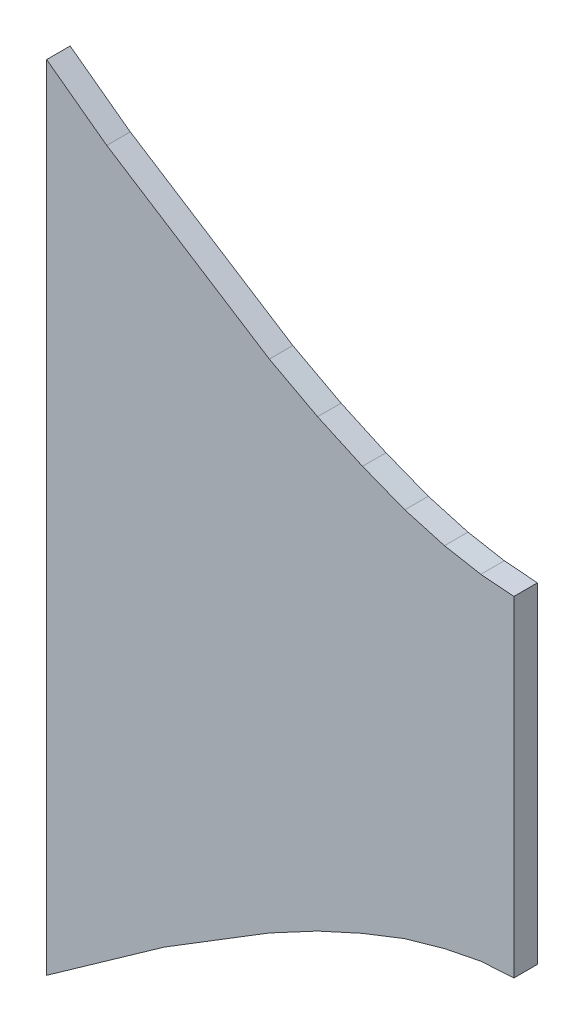
ISO-10303-21;
HEADER;
FILE_DESCRIPTION(('STEP AP214'),'2;1');
FILE_NAME('part.step','',(''),(''),'','','');
FILE_SCHEMA(('AUTOMOTIVE_DESIGN { 1 0 10303 214 1 1 1 1 }'));
ENDSEC;
DATA;
#1=APPLICATION_CONTEXT('core data for automotive mechanical design processes');
#2=APPLICATION_PROTOCOL_DEFINITION('international standard','automotive_design',2000,#1);
#3=PRODUCT_CONTEXT('',#1,'mechanical');
#4=PRODUCT('Part','Part','',(#3));
#5=PRODUCT_RELATED_PRODUCT_CATEGORY('part','',(#4));
#6=PRODUCT_DEFINITION_FORMATION('','',#4);
#7=PRODUCT_DEFINITION_CONTEXT('part definition',#1,'design');
#8=PRODUCT_DEFINITION('design','',#6,#7);
#9=PRODUCT_DEFINITION_SHAPE('','',#8);
#10=(LENGTH_UNIT() NAMED_UNIT(*) SI_UNIT(.MILLI.,.METRE.));
#11=(NAMED_UNIT(*) PLANE_ANGLE_UNIT() SI_UNIT($,.RADIAN.));
#12=(NAMED_UNIT(*) SI_UNIT($,.STERADIAN.) SOLID_ANGLE_UNIT());
#13=UNCERTAINTY_MEASURE_WITH_UNIT(LENGTH_MEASURE(1.E-05),#10,'distance_accuracy_value','');
#14=(GEOMETRIC_REPRESENTATION_CONTEXT(3) GLOBAL_UNCERTAINTY_ASSIGNED_CONTEXT((#13)) GLOBAL_UNIT_ASSIGNED_CONTEXT((#10,
#11,#12)) REPRESENTATION_CONTEXT('',''));
#15=CARTESIAN_POINT('',(0.,0.,0.));
#16=DIRECTION('',(0.,0.,1.));
#17=DIRECTION('',(1.,0.,0.));
#18=AXIS2_PLACEMENT_3D('',#15,#16,#17);
#19=CARTESIAN_POINT('',(51.8079986572266,109.157997131348,0.));
#20=DIRECTION('',(-1.,0.,0.));
#21=DIRECTION('',(0.,1.,0.));
#22=AXIS2_PLACEMENT_3D('',#19,#20,#21);
#23=PLANE('',#22);
#24=DIRECTION('',(0.,1.,0.));
#25=VECTOR('',#24,1.);
#26=CARTESIAN_POINT('',(51.8079986572266,109.157997131348,0.03556));
#27=LINE('',#26,#25);
#28=CARTESIAN_POINT('',(51.8079986572266,109.157997131348,0.03556));
#29=VERTEX_POINT('',#28);
#30=CARTESIAN_POINT('',(51.8079986572266,109.657997131348,0.03556));
#31=VERTEX_POINT('',#30);
#32=EDGE_CURVE('E11',#29,#31,#27,.T.);
#33=ORIENTED_EDGE('',*,*,#32,.F.);
#34=DIRECTION('',(0.,0.,1.));
#35=VECTOR('',#34,1.);
#36=CARTESIAN_POINT('',(51.8079986572266,109.157997131348,0.));
#37=LINE('',#36,#35);
#38=CARTESIAN_POINT('',(51.8079986572266,109.157997131348,0.));
#39=VERTEX_POINT('',#38);
#40=EDGE_CURVE('E24',#39,#29,#37,.T.);
#41=ORIENTED_EDGE('',*,*,#40,.F.);
#42=DIRECTION('',(0.,1.,0.));
#43=VECTOR('',#42,1.);
#44=CARTESIAN_POINT('',(51.8079986572266,109.157997131348,0.));
#45=LINE('',#44,#43);
#46=CARTESIAN_POINT('',(51.8079986572266,109.657997131348,0.));
#47=VERTEX_POINT('',#46);
#48=EDGE_CURVE('E323',#39,#47,#45,.T.);
#49=ORIENTED_EDGE('',*,*,#48,.T.);
#50=DIRECTION('',(0.,0.,1.));
#51=VECTOR('',#50,1.);
#52=CARTESIAN_POINT('',(51.8079986572266,109.657997131348,0.));
#53=LINE('',#52,#51);
#54=EDGE_CURVE('E37',#47,#31,#53,.T.);
#55=ORIENTED_EDGE('',*,*,#54,.T.);
#56=EDGE_LOOP('',(#33,#41,#49,#55));
#57=FACE_BOUND('',#56,.T.);
#58=ADVANCED_FACE('F17',(#57),#23,.F.);
#59=CARTESIAN_POINT('',(51.757999420166,109.154998779297,0.));
#60=DIRECTION('',(-0.0598604189522905,0.998206757261669,0.));
#61=DIRECTION('',(0.998206757261669,0.0598604189522905,0.));
#62=AXIS2_PLACEMENT_3D('',#59,#60,#61);
#63=PLANE('',#62);
#64=DIRECTION('',(0.998206757261669,0.0598604189522905,0.));
#65=VECTOR('',#64,1.);
#66=CARTESIAN_POINT('',(51.757999420166,109.154998779297,0.03556));
#67=LINE('',#66,#65);
#68=CARTESIAN_POINT('',(51.757999420166,109.154998779297,0.03556));
#69=VERTEX_POINT('',#68);
#70=EDGE_CURVE('E319',#69,#29,#67,.T.);
#71=ORIENTED_EDGE('',*,*,#70,.F.);
#72=DIRECTION('',(0.,0.,1.));
#73=VECTOR('',#72,1.);
#74=CARTESIAN_POINT('',(51.757999420166,109.154998779297,0.));
#75=LINE('',#74,#73);
#76=CARTESIAN_POINT('',(51.757999420166,109.154998779297,0.));
#77=VERTEX_POINT('',#76);
#78=EDGE_CURVE('E317',#77,#69,#75,.T.);
#79=ORIENTED_EDGE('',*,*,#78,.F.);
#80=DIRECTION('',(0.998206757261669,0.0598604189522905,0.));
#81=VECTOR('',#80,1.);
#82=CARTESIAN_POINT('',(51.757999420166,109.154998779297,0.));
#83=LINE('',#82,#81);
#84=EDGE_CURVE('E315',#77,#39,#83,.T.);
#85=ORIENTED_EDGE('',*,*,#84,.T.);
#86=ORIENTED_EDGE('',*,*,#40,.T.);
#87=EDGE_LOOP('',(#71,#79,#85,#86));
#88=FACE_BOUND('',#87,.T.);
#89=ADVANCED_FACE('F326',(#88),#63,.F.);
#90=CARTESIAN_POINT('',(51.7029991149902,109.143997192383,0.));
#91=DIRECTION('',(-0.196142292954482,0.980575443764812,0.));
#92=DIRECTION('',(0.980575443764812,0.196142292954482,0.));
#93=AXIS2_PLACEMENT_3D('',#90,#91,#92);
#94=PLANE('',#93);
#95=DIRECTION('',(0.980575443764812,0.196142292954482,0.));
#96=VECTOR('',#95,1.);
#97=CARTESIAN_POINT('',(51.7029991149902,109.143997192383,0.03556));
#98=LINE('',#97,#96);
#99=CARTESIAN_POINT('',(51.7029991149902,109.143997192383,0.03556));
#100=VERTEX_POINT('',#99);
#101=EDGE_CURVE('E312',#100,#69,#98,.T.);
#102=ORIENTED_EDGE('',*,*,#101,.F.);
#103=DIRECTION('',(0.,0.,1.));
#104=VECTOR('',#103,1.);
#105=CARTESIAN_POINT('',(51.7029991149902,109.143997192383,0.));
#106=LINE('',#105,#104);
#107=CARTESIAN_POINT('',(51.7029991149902,109.143997192383,0.));
#108=VERTEX_POINT('',#107);
#109=EDGE_CURVE('E310',#108,#100,#106,.T.);
#110=ORIENTED_EDGE('',*,*,#109,.F.);
#111=DIRECTION('',(0.980575443764812,0.196142292954482,0.));
#112=VECTOR('',#111,1.);
#113=CARTESIAN_POINT('',(51.7029991149902,109.143997192383,0.));
#114=LINE('',#113,#112);
#115=EDGE_CURVE('E307',#108,#77,#114,.T.);
#116=ORIENTED_EDGE('',*,*,#115,.T.);
#117=ORIENTED_EDGE('',*,*,#78,.T.);
#118=EDGE_LOOP('',(#102,#110,#116,#117));
#119=FACE_BOUND('',#118,.T.);
#120=ADVANCED_FACE('F329',(#119),#94,.F.);
#121=CARTESIAN_POINT('',(51.6430015563965,109.126998901367,0.));
#122=DIRECTION('',(-0.272587471829552,0.962131004698203,0.));
#123=DIRECTION('',(0.962131004698203,0.272587471829552,0.));
#124=AXIS2_PLACEMENT_3D('',#121,#122,#123);
#125=PLANE('',#124);
#126=DIRECTION('',(0.962131004698203,0.272587471829552,0.));
#127=VECTOR('',#126,1.);
#128=CARTESIAN_POINT('',(51.6430015563965,109.126998901367,0.03556));
#129=LINE('',#128,#127);
#130=CARTESIAN_POINT('',(51.6430015563965,109.126998901367,0.03556));
#131=VERTEX_POINT('',#130);
#132=EDGE_CURVE('E304',#131,#100,#129,.T.);
#133=ORIENTED_EDGE('',*,*,#132,.F.);
#134=DIRECTION('',(0.,0.,1.));
#135=VECTOR('',#134,1.);
#136=CARTESIAN_POINT('',(51.6430015563965,109.126998901367,0.));
#137=LINE('',#136,#135);
#138=CARTESIAN_POINT('',(51.6430015563965,109.126998901367,0.));
#139=VERTEX_POINT('',#138);
#140=EDGE_CURVE('E302',#139,#131,#137,.T.);
#141=ORIENTED_EDGE('',*,*,#140,.F.);
#142=DIRECTION('',(0.962131004698203,0.272587471829552,0.));
#143=VECTOR('',#142,1.);
#144=CARTESIAN_POINT('',(51.6430015563965,109.126998901367,0.));
#145=LINE('',#144,#143);
#146=EDGE_CURVE('E299',#139,#108,#145,.T.);
#147=ORIENTED_EDGE('',*,*,#146,.T.);
#148=ORIENTED_EDGE('',*,*,#109,.T.);
#149=EDGE_LOOP('',(#133,#141,#147,#148));
#150=FACE_BOUND('',#149,.T.);
#151=ADVANCED_FACE('F334',(#150),#125,.F.);
#152=CARTESIAN_POINT('',(51.5789985656738,109.101997375488,0.));
#153=DIRECTION('',(-0.363855042774888,0.931455585547311,0.));
#154=DIRECTION('',(0.931455585547311,0.363855042774888,0.));
#155=AXIS2_PLACEMENT_3D('',#152,#153,#154);
#156=PLANE('',#155);
#157=DIRECTION('',(0.931455585547311,0.363855042774888,0.));
#158=VECTOR('',#157,1.);
#159=CARTESIAN_POINT('',(51.5789985656738,109.101997375488,0.03556));
#160=LINE('',#159,#158);
#161=CARTESIAN_POINT('',(51.5789985656738,109.101997375488,0.03556));
#162=VERTEX_POINT('',#161);
#163=EDGE_CURVE('E296',#162,#131,#160,.T.);
#164=ORIENTED_EDGE('',*,*,#163,.F.);
#165=DIRECTION('',(0.,0.,1.));
#166=VECTOR('',#165,1.);
#167=CARTESIAN_POINT('',(51.5789985656738,109.101997375488,0.));
#168=LINE('',#167,#166);
#169=CARTESIAN_POINT('',(51.5789985656738,109.101997375488,0.));
#170=VERTEX_POINT('',#169);
#171=EDGE_CURVE('E294',#170,#162,#168,.T.);
#172=ORIENTED_EDGE('',*,*,#171,.F.);
#173=DIRECTION('',(0.931455585547311,0.363855042774888,0.));
#174=VECTOR('',#173,1.);
#175=CARTESIAN_POINT('',(51.5789985656738,109.101997375488,0.));
#176=LINE('',#175,#174);
#177=EDGE_CURVE('E291',#170,#139,#176,.T.);
#178=ORIENTED_EDGE('',*,*,#177,.T.);
#179=ORIENTED_EDGE('',*,*,#140,.T.);
#180=EDGE_LOOP('',(#164,#172,#178,#179));
#181=FACE_BOUND('',#180,.T.);
#182=ADVANCED_FACE('F337',(#181),#156,.F.);
#183=CARTESIAN_POINT('',(51.5110015869141,109.070999145508,0.));
#184=DIRECTION('',(-0.414806497087757,0.909909649346453,0.));
#185=DIRECTION('',(0.909909649346453,0.414806497087757,0.));
#186=AXIS2_PLACEMENT_3D('',#183,#184,#185);
#187=PLANE('',#186);
#188=DIRECTION('',(0.909909649346453,0.414806497087757,0.));
#189=VECTOR('',#188,1.);
#190=CARTESIAN_POINT('',(51.5110015869141,109.070999145508,0.03556));
#191=LINE('',#190,#189);
#192=CARTESIAN_POINT('',(51.5110015869141,109.070999145508,0.03556));
#193=VERTEX_POINT('',#192);
#194=EDGE_CURVE('E288',#193,#162,#191,.T.);
#195=ORIENTED_EDGE('',*,*,#194,.F.);
#196=DIRECTION('',(0.,0.,1.));
#197=VECTOR('',#196,1.);
#198=CARTESIAN_POINT('',(51.5110015869141,109.070999145508,0.));
#199=LINE('',#198,#197);
#200=CARTESIAN_POINT('',(51.5110015869141,109.070999145508,0.));
#201=VERTEX_POINT('',#200);
#202=EDGE_CURVE('E286',#201,#193,#199,.T.);
#203=ORIENTED_EDGE('',*,*,#202,.F.);
#204=DIRECTION('',(0.909909649346453,0.414806497087757,0.));
#205=VECTOR('',#204,1.);
#206=CARTESIAN_POINT('',(51.5110015869141,109.070999145508,0.));
#207=LINE('',#206,#205);
#208=EDGE_CURVE('E283',#201,#170,#207,.T.);
#209=ORIENTED_EDGE('',*,*,#208,.T.);
#210=ORIENTED_EDGE('',*,*,#171,.T.);
#211=EDGE_LOOP('',(#195,#203,#209,#210));
#212=FACE_BOUND('',#211,.T.);
#213=ADVANCED_FACE('F342',(#212),#187,.F.);
#214=CARTESIAN_POINT('',(51.4379997253418,109.031997680664,0.));
#215=DIRECTION('',(-0.471219653352262,0.882015894581597,0.));
#216=DIRECTION('',(0.882015894581597,0.471219653352262,0.));
#217=AXIS2_PLACEMENT_3D('',#214,#215,#216);
#218=PLANE('',#217);
#219=DIRECTION('',(0.882015894581597,0.471219653352262,0.));
#220=VECTOR('',#219,1.);
#221=CARTESIAN_POINT('',(51.4379997253418,109.031997680664,0.03556));
#222=LINE('',#221,#220);
#223=CARTESIAN_POINT('',(51.4379997253418,109.031997680664,0.03556));
#224=VERTEX_POINT('',#223);
#225=EDGE_CURVE('E280',#224,#193,#222,.T.);
#226=ORIENTED_EDGE('',*,*,#225,.F.);
#227=DIRECTION('',(0.,0.,1.));
#228=VECTOR('',#227,1.);
#229=CARTESIAN_POINT('',(51.4379997253418,109.031997680664,0.));
#230=LINE('',#229,#228);
#231=CARTESIAN_POINT('',(51.4379997253418,109.031997680664,0.));
#232=VERTEX_POINT('',#231);
#233=EDGE_CURVE('E278',#232,#224,#230,.T.);
#234=ORIENTED_EDGE('',*,*,#233,.F.);
#235=DIRECTION('',(0.882015894581597,0.471219653352262,0.));
#236=VECTOR('',#235,1.);
#237=CARTESIAN_POINT('',(51.4379997253418,109.031997680664,0.));
#238=LINE('',#237,#236);
#239=EDGE_CURVE('E275',#232,#201,#238,.T.);
#240=ORIENTED_EDGE('',*,*,#239,.T.);
#241=ORIENTED_EDGE('',*,*,#202,.T.);
#242=EDGE_LOOP('',(#226,#234,#240,#241));
#243=FACE_BOUND('',#242,.T.);
#244=ADVANCED_FACE('F345',(#243),#218,.F.);
#245=CARTESIAN_POINT('',(51.2789993286133,108.93399810791,0.));
#246=DIRECTION('',(-0.524692135391381,0.851292055089458,0.));
#247=DIRECTION('',(0.851292055089458,0.524692135391381,0.));
#248=AXIS2_PLACEMENT_3D('',#245,#246,#247);
#249=PLANE('',#248);
#250=DIRECTION('',(0.851292055089458,0.524692135391381,0.));
#251=VECTOR('',#250,1.);
#252=CARTESIAN_POINT('',(51.2789993286133,108.93399810791,0.03556));
#253=LINE('',#252,#251);
#254=CARTESIAN_POINT('',(51.2789993286133,108.93399810791,0.03556));
#255=VERTEX_POINT('',#254);
#256=EDGE_CURVE('E272',#255,#224,#253,.T.);
#257=ORIENTED_EDGE('',*,*,#256,.F.);
#258=DIRECTION('',(0.,0.,1.));
#259=VECTOR('',#258,1.);
#260=CARTESIAN_POINT('',(51.2789993286133,108.93399810791,0.));
#261=LINE('',#260,#259);
#262=CARTESIAN_POINT('',(51.2789993286133,108.93399810791,0.));
#263=VERTEX_POINT('',#262);
#264=EDGE_CURVE('E270',#263,#255,#261,.T.);
#265=ORIENTED_EDGE('',*,*,#264,.F.);
#266=DIRECTION('',(0.851292055089458,0.524692135391381,0.));
#267=VECTOR('',#266,1.);
#268=CARTESIAN_POINT('',(51.2789993286133,108.93399810791,0.));
#269=LINE('',#268,#267);
#270=EDGE_CURVE('E267',#263,#232,#269,.T.);
#271=ORIENTED_EDGE('',*,*,#270,.T.);
#272=ORIENTED_EDGE('',*,*,#233,.T.);
#273=EDGE_LOOP('',(#257,#265,#271,#272));
#274=FACE_BOUND('',#273,.T.);
#275=ADVANCED_FACE('F350',(#274),#249,.F.);
#276=CARTESIAN_POINT('',(51.101001739502,108.807998657227,0.));
#277=DIRECTION('',(-0.577766396861462,0.8162021751121,0.));
#278=DIRECTION('',(0.8162021751121,0.577766396861462,0.));
#279=AXIS2_PLACEMENT_3D('',#276,#277,#278);
#280=PLANE('',#279);
#281=DIRECTION('',(0.8162021751121,0.577766396861462,0.));
#282=VECTOR('',#281,1.);
#283=CARTESIAN_POINT('',(51.101001739502,108.807998657227,0.03556));
#284=LINE('',#283,#282);
#285=CARTESIAN_POINT('',(51.101001739502,108.807998657227,0.03556));
#286=VERTEX_POINT('',#285);
#287=EDGE_CURVE('E264',#286,#255,#284,.T.);
#288=ORIENTED_EDGE('',*,*,#287,.F.);
#289=DIRECTION('',(0.,0.,1.));
#290=VECTOR('',#289,1.);
#291=CARTESIAN_POINT('',(51.101001739502,108.807998657227,0.));
#292=LINE('',#291,#290);
#293=CARTESIAN_POINT('',(51.101001739502,108.807998657227,0.));
#294=VERTEX_POINT('',#293);
#295=EDGE_CURVE('E262',#294,#286,#292,.T.);
#296=ORIENTED_EDGE('',*,*,#295,.F.);
#297=DIRECTION('',(0.8162021751121,0.577766396861462,0.));
#298=VECTOR('',#297,1.);
#299=CARTESIAN_POINT('',(51.101001739502,108.807998657227,0.));
#300=LINE('',#299,#298);
#301=EDGE_CURVE('E259',#294,#263,#300,.T.);
#302=ORIENTED_EDGE('',*,*,#301,.T.);
#303=ORIENTED_EDGE('',*,*,#264,.T.);
#304=EDGE_LOOP('',(#288,#296,#302,#303));
#305=FACE_BOUND('',#304,.T.);
#306=ADVANCED_FACE('F353',(#305),#280,.F.);
#307=CARTESIAN_POINT('',(51.101001739502,109.40708104434,0.));
#308=DIRECTION('',(1.,0.,0.));
#309=DIRECTION('',(0.,-1.,0.));
#310=AXIS2_PLACEMENT_3D('',#307,#308,#309);
#311=PLANE('',#310);
#312=DIRECTION('',(0.,-1.,0.));
#313=VECTOR('',#312,1.);
#314=CARTESIAN_POINT('',(51.101001739502,110.008003234863,0.03556));
#315=LINE('',#314,#313);
#316=CARTESIAN_POINT('',(51.101001739502,109.40708104434,0.03556));
#317=VERTEX_POINT('',#316);
#318=EDGE_CURVE('E256',#317,#286,#315,.T.);
#319=ORIENTED_EDGE('',*,*,#318,.F.);
#320=DIRECTION('',(0.,0.,1.));
#321=VECTOR('',#320,1.);
#322=CARTESIAN_POINT('',(51.101001739502,109.40708104434,0.));
#323=LINE('',#322,#321);
#324=CARTESIAN_POINT('',(51.101001739502,109.40708104434,0.));
#325=VERTEX_POINT('',#324);
#326=EDGE_CURVE('E254',#325,#317,#323,.T.);
#327=ORIENTED_EDGE('',*,*,#326,.F.);
#328=DIRECTION('',(0.,-1.,0.));
#329=VECTOR('',#328,1.);
#330=CARTESIAN_POINT('',(51.101001739502,110.008003234863,0.));
#331=LINE('',#330,#329);
#332=EDGE_CURVE('E251',#325,#294,#331,.T.);
#333=ORIENTED_EDGE('',*,*,#332,.T.);
#334=ORIENTED_EDGE('',*,*,#295,.T.);
#335=EDGE_LOOP('',(#319,#327,#333,#334));
#336=FACE_BOUND('',#335,.T.);
#337=ADVANCED_FACE('F358',(#336),#311,.F.);
#338=CARTESIAN_POINT('',(50.6510036,109.4080108,0.));
#339=DIRECTION('',(0.,0.,-1.));
#340=DIRECTION('',(1.,0.,0.));
#341=AXIS2_PLACEMENT_3D('',#338,#339,#340);
#342=CYLINDRICAL_SURFACE('',#341,0.4499991);
#343=ORIENTED_EDGE('',*,*,#326,.T.);
#344=CARTESIAN_POINT('',(50.6510036,109.4080108,0.03556));
#345=DIRECTION('',(0.,0.,1.));
#346=DIRECTION('',(1.,0.,0.));
#347=AXIS2_PLACEMENT_3D('',#344,#345,#346);
#348=CIRCLE('',#347,0.4499991);
#349=CARTESIAN_POINT('',(51.1010027,109.4080108,0.03556));
#350=VERTEX_POINT('',#349);
#351=EDGE_CURVE('E248',#317,#350,#348,.T.);
#352=ORIENTED_EDGE('',*,*,#351,.T.);
#353=DIRECTION('',(0.,0.,1.));
#354=VECTOR('',#353,1.);
#355=CARTESIAN_POINT('',(51.1010027,109.4080108,0.));
#356=LINE('',#355,#354);
#357=CARTESIAN_POINT('',(51.1010027,109.4080108,0.));
#358=VERTEX_POINT('',#357);
#359=EDGE_CURVE('E246',#358,#350,#356,.T.);
#360=ORIENTED_EDGE('',*,*,#359,.F.);
#361=CARTESIAN_POINT('',(50.6510036,109.4080108,0.));
#362=DIRECTION('',(0.,0.,1.));
#363=DIRECTION('',(1.,0.,0.));
#364=AXIS2_PLACEMENT_3D('',#361,#362,#363);
#365=CIRCLE('',#364,0.4499991);
#366=EDGE_CURVE('E243',#325,#358,#365,.T.);
#367=ORIENTED_EDGE('',*,*,#366,.F.);
#368=EDGE_LOOP('',(#343,#352,#360,#367));
#369=FACE_BOUND('',#368,.T.);
#370=ADVANCED_FACE('F361',(#369),#342,.F.);
#371=CARTESIAN_POINT('',(50.6510036,109.4080108,0.));
#372=DIRECTION('',(0.,0.,-1.));
#373=DIRECTION('',(1.,0.,0.));
#374=AXIS2_PLACEMENT_3D('',#371,#372,#373);
#375=CYLINDRICAL_SURFACE('',#374,0.4499991);
#376=ORIENTED_EDGE('',*,*,#359,.T.);
#377=CARTESIAN_POINT('',(50.6510036,109.4080108,0.03556));
#378=DIRECTION('',(0.,0.,1.));
#379=DIRECTION('',(1.,0.,0.));
#380=AXIS2_PLACEMENT_3D('',#377,#378,#379);
#381=CIRCLE('',#380,0.4499991);
#382=CARTESIAN_POINT('',(51.101001739502,109.40894055566,0.03556));
#383=VERTEX_POINT('',#382);
#384=EDGE_CURVE('E240',#350,#383,#381,.T.);
#385=ORIENTED_EDGE('',*,*,#384,.T.);
#386=DIRECTION('',(0.,0.,1.));
#387=VECTOR('',#386,1.);
#388=CARTESIAN_POINT('',(51.101001739502,109.40894055566,0.));
#389=LINE('',#388,#387);
#390=CARTESIAN_POINT('',(51.101001739502,109.40894055566,0.));
#391=VERTEX_POINT('',#390);
#392=EDGE_CURVE('E238',#391,#383,#389,.T.);
#393=ORIENTED_EDGE('',*,*,#392,.F.);
#394=EDGE_CURVE('E237',#358,#391,#365,.T.);
#395=ORIENTED_EDGE('',*,*,#394,.F.);
#396=EDGE_LOOP('',(#376,#385,#393,#395));
#397=FACE_BOUND('',#396,.T.);
#398=ADVANCED_FACE('F368',(#397),#375,.F.);
#399=CARTESIAN_POINT('',(51.101001739502,110.008003234863,0.));
#400=DIRECTION('',(1.,0.,0.));
#401=DIRECTION('',(0.,-1.,0.));
#402=AXIS2_PLACEMENT_3D('',#399,#400,#401);
#403=PLANE('',#402);
#404=DIRECTION('',(0.,-1.,0.));
#405=VECTOR('',#404,1.);
#406=CARTESIAN_POINT('',(51.101001739502,110.008003234863,0.03556));
#407=LINE('',#406,#405);
#408=CARTESIAN_POINT('',(51.101001739502,110.008003234863,0.03556));
#409=VERTEX_POINT('',#408);
#410=EDGE_CURVE('E234',#409,#383,#407,.T.);
#411=ORIENTED_EDGE('',*,*,#410,.F.);
#412=DIRECTION('',(0.,0.,1.));
#413=VECTOR('',#412,1.);
#414=CARTESIAN_POINT('',(51.101001739502,110.008003234863,0.));
#415=LINE('',#414,#413);
#416=CARTESIAN_POINT('',(51.101001739502,110.008003234863,0.));
#417=VERTEX_POINT('',#416);
#418=EDGE_CURVE('E232',#417,#409,#415,.T.);
#419=ORIENTED_EDGE('',*,*,#418,.F.);
#420=EDGE_CURVE('E231',#417,#391,#331,.T.);
#421=ORIENTED_EDGE('',*,*,#420,.T.);
#422=ORIENTED_EDGE('',*,*,#392,.T.);
#423=EDGE_LOOP('',(#411,#419,#421,#422));
#424=FACE_BOUND('',#423,.T.);
#425=ADVANCED_FACE('F371',(#424),#403,.F.);
#426=CARTESIAN_POINT('',(51.1920013427734,109.94100189209,0.));
#427=DIRECTION('',(-0.592906519746556,-0.805271295180716,0.));
#428=DIRECTION('',(-0.805271295180716,0.592906519746556,0.));
#429=AXIS2_PLACEMENT_3D('',#426,#427,#428);
#430=PLANE('',#429);
#431=DIRECTION('',(-0.805271295180716,0.592906519746556,0.));
#432=VECTOR('',#431,1.);
#433=CARTESIAN_POINT('',(51.1920013427734,109.94100189209,0.03556));
#434=LINE('',#433,#432);
#435=CARTESIAN_POINT('',(51.1920013427734,109.94100189209,0.03556));
#436=VERTEX_POINT('',#435);
#437=EDGE_CURVE('E228',#436,#409,#434,.T.);
#438=ORIENTED_EDGE('',*,*,#437,.F.);
#439=DIRECTION('',(0.,0.,1.));
#440=VECTOR('',#439,1.);
#441=CARTESIAN_POINT('',(51.1920013427734,109.94100189209,0.));
#442=LINE('',#441,#440);
#443=CARTESIAN_POINT('',(51.1920013427734,109.94100189209,0.));
#444=VERTEX_POINT('',#443);
#445=EDGE_CURVE('E226',#444,#436,#442,.T.);
#446=ORIENTED_EDGE('',*,*,#445,.F.);
#447=DIRECTION('',(-0.805271295180716,0.592906519746556,0.));
#448=VECTOR('',#447,1.);
#449=CARTESIAN_POINT('',(51.1920013427734,109.94100189209,0.));
#450=LINE('',#449,#448);
#451=EDGE_CURVE('E223',#444,#417,#450,.T.);
#452=ORIENTED_EDGE('',*,*,#451,.T.);
#453=ORIENTED_EDGE('',*,*,#418,.T.);
#454=EDGE_LOOP('',(#438,#446,#452,#453));
#455=FACE_BOUND('',#454,.T.);
#456=ADVANCED_FACE('F376',(#455),#430,.F.);
#457=CARTESIAN_POINT('',(51.4379997253418,109.783996582031,0.));
#458=DIRECTION('',(-0.537999092558225,-0.842945417216635,0.));
#459=DIRECTION('',(-0.842945417216635,0.537999092558225,0.));
#460=AXIS2_PLACEMENT_3D('',#457,#458,#459);
#461=PLANE('',#460);
#462=DIRECTION('',(-0.842945417216635,0.537999092558225,0.));
#463=VECTOR('',#462,1.);
#464=CARTESIAN_POINT('',(51.4379997253418,109.783996582031,0.03556));
#465=LINE('',#464,#463);
#466=CARTESIAN_POINT('',(51.4379997253418,109.783996582031,0.03556));
#467=VERTEX_POINT('',#466);
#468=EDGE_CURVE('E220',#467,#436,#465,.T.);
#469=ORIENTED_EDGE('',*,*,#468,.F.);
#470=DIRECTION('',(0.,0.,1.));
#471=VECTOR('',#470,1.);
#472=CARTESIAN_POINT('',(51.4379997253418,109.783996582031,0.));
#473=LINE('',#472,#471);
#474=CARTESIAN_POINT('',(51.4379997253418,109.783996582031,0.));
#475=VERTEX_POINT('',#474);
#476=EDGE_CURVE('E218',#475,#467,#473,.T.);
#477=ORIENTED_EDGE('',*,*,#476,.F.);
#478=DIRECTION('',(-0.842945417216635,0.537999092558225,0.));
#479=VECTOR('',#478,1.);
#480=CARTESIAN_POINT('',(51.4379997253418,109.783996582031,0.));
#481=LINE('',#480,#479);
#482=EDGE_CURVE('E215',#475,#444,#481,.T.);
#483=ORIENTED_EDGE('',*,*,#482,.T.);
#484=ORIENTED_EDGE('',*,*,#445,.T.);
#485=EDGE_LOOP('',(#469,#477,#483,#484));
#486=FACE_BOUND('',#485,.T.);
#487=ADVANCED_FACE('F379',(#486),#461,.F.);
#488=CARTESIAN_POINT('',(51.5110015869141,109.745002746582,0.));
#489=DIRECTION('',(-0.471147937746847,-0.882054205112641,0.));
#490=DIRECTION('',(-0.882054205112641,0.471147937746847,0.));
#491=AXIS2_PLACEMENT_3D('',#488,#489,#490);
#492=PLANE('',#491);
#493=DIRECTION('',(-0.882054205112641,0.471147937746847,0.));
#494=VECTOR('',#493,1.);
#495=CARTESIAN_POINT('',(51.5110015869141,109.745002746582,0.03556));
#496=LINE('',#495,#494);
#497=CARTESIAN_POINT('',(51.5110015869141,109.745002746582,0.03556));
#498=VERTEX_POINT('',#497);
#499=EDGE_CURVE('E212',#498,#467,#496,.T.);
#500=ORIENTED_EDGE('',*,*,#499,.F.);
#501=DIRECTION('',(0.,0.,1.));
#502=VECTOR('',#501,1.);
#503=CARTESIAN_POINT('',(51.5110015869141,109.745002746582,0.));
#504=LINE('',#503,#502);
#505=CARTESIAN_POINT('',(51.5110015869141,109.745002746582,0.));
#506=VERTEX_POINT('',#505);
#507=EDGE_CURVE('E210',#506,#498,#504,.T.);
#508=ORIENTED_EDGE('',*,*,#507,.F.);
#509=DIRECTION('',(-0.882054205112641,0.471147937746847,0.));
#510=VECTOR('',#509,1.);
#511=CARTESIAN_POINT('',(51.5110015869141,109.745002746582,0.));
#512=LINE('',#511,#510);
#513=EDGE_CURVE('E207',#506,#475,#512,.T.);
#514=ORIENTED_EDGE('',*,*,#513,.T.);
#515=ORIENTED_EDGE('',*,*,#476,.T.);
#516=EDGE_LOOP('',(#500,#508,#514,#515));
#517=FACE_BOUND('',#516,.T.);
#518=ADVANCED_FACE('F384',(#517),#492,.F.);
#519=CARTESIAN_POINT('',(51.5789985656738,109.713996887207,0.));
#520=DIRECTION('',(-0.414891018681954,-0.909871113189693,0.));
#521=DIRECTION('',(-0.909871113189693,0.414891018681954,0.));
#522=AXIS2_PLACEMENT_3D('',#519,#520,#521);
#523=PLANE('',#522);
#524=DIRECTION('',(-0.909871113189693,0.414891018681954,0.));
#525=VECTOR('',#524,1.);
#526=CARTESIAN_POINT('',(51.5789985656738,109.713996887207,0.03556));
#527=LINE('',#526,#525);
#528=CARTESIAN_POINT('',(51.5789985656738,109.713996887207,0.03556));
#529=VERTEX_POINT('',#528);
#530=EDGE_CURVE('E204',#529,#498,#527,.T.);
#531=ORIENTED_EDGE('',*,*,#530,.F.);
#532=DIRECTION('',(0.,0.,1.));
#533=VECTOR('',#532,1.);
#534=CARTESIAN_POINT('',(51.5789985656738,109.713996887207,0.));
#535=LINE('',#534,#533);
#536=CARTESIAN_POINT('',(51.5789985656738,109.713996887207,0.));
#537=VERTEX_POINT('',#536);
#538=EDGE_CURVE('E202',#537,#529,#535,.T.);
#539=ORIENTED_EDGE('',*,*,#538,.F.);
#540=DIRECTION('',(-0.909871113189693,0.414891018681954,0.));
#541=VECTOR('',#540,1.);
#542=CARTESIAN_POINT('',(51.5789985656738,109.713996887207,0.));
#543=LINE('',#542,#541);
#544=EDGE_CURVE('E199',#537,#506,#543,.T.);
#545=ORIENTED_EDGE('',*,*,#544,.T.);
#546=ORIENTED_EDGE('',*,*,#507,.T.);
#547=EDGE_LOOP('',(#531,#539,#545,#546));
#548=FACE_BOUND('',#547,.T.);
#549=ADVANCED_FACE('F387',(#548),#523,.F.);
#550=CARTESIAN_POINT('',(51.6430015563965,109.689002990723,0.));
#551=DIRECTION('',(-0.363758703676828,-0.931493212803697,0.));
#552=DIRECTION('',(-0.931493212803697,0.363758703676828,0.));
#553=AXIS2_PLACEMENT_3D('',#550,#551,#552);
#554=PLANE('',#553);
#555=DIRECTION('',(-0.931493212803697,0.363758703676828,0.));
#556=VECTOR('',#555,1.);
#557=CARTESIAN_POINT('',(51.6430015563965,109.689002990723,0.03556));
#558=LINE('',#557,#556);
#559=CARTESIAN_POINT('',(51.6430015563965,109.689002990723,0.03556));
#560=VERTEX_POINT('',#559);
#561=EDGE_CURVE('E196',#560,#529,#558,.T.);
#562=ORIENTED_EDGE('',*,*,#561,.F.);
#563=DIRECTION('',(0.,0.,1.));
#564=VECTOR('',#563,1.);
#565=CARTESIAN_POINT('',(51.6430015563965,109.689002990723,0.));
#566=LINE('',#565,#564);
#567=CARTESIAN_POINT('',(51.6430015563965,109.689002990723,0.));
#568=VERTEX_POINT('',#567);
#569=EDGE_CURVE('E194',#568,#560,#566,.T.);
#570=ORIENTED_EDGE('',*,*,#569,.F.);
#571=DIRECTION('',(-0.931493212803697,0.363758703676828,0.));
#572=VECTOR('',#571,1.);
#573=CARTESIAN_POINT('',(51.6430015563965,109.689002990723,0.));
#574=LINE('',#573,#572);
#575=EDGE_CURVE('E191',#568,#537,#574,.T.);
#576=ORIENTED_EDGE('',*,*,#575,.T.);
#577=ORIENTED_EDGE('',*,*,#538,.T.);
#578=EDGE_LOOP('',(#562,#570,#576,#577));
#579=FACE_BOUND('',#578,.T.);
#580=ADVANCED_FACE('F390',(#579),#554,.F.);
#581=CARTESIAN_POINT('',(51.7029991149902,109.671997070312,0.));
#582=DIRECTION('',(-0.272700721617381,-0.962098911978056,0.));
#583=DIRECTION('',(-0.962098911978056,0.272700721617381,0.));
#584=AXIS2_PLACEMENT_3D('',#581,#582,#583);
#585=PLANE('',#584);
#586=DIRECTION('',(-0.962098911978056,0.272700721617381,0.));
#587=VECTOR('',#586,1.);
#588=CARTESIAN_POINT('',(51.7029991149902,109.671997070312,0.03556));
#589=LINE('',#588,#587);
#590=CARTESIAN_POINT('',(51.7029991149902,109.671997070312,0.03556));
#591=VERTEX_POINT('',#590);
#592=EDGE_CURVE('E188',#591,#560,#589,.T.);
#593=ORIENTED_EDGE('',*,*,#592,.F.);
#594=DIRECTION('',(0.,0.,1.));
#595=VECTOR('',#594,1.);
#596=CARTESIAN_POINT('',(51.7029991149902,109.671997070312,0.));
#597=LINE('',#596,#595);
#598=CARTESIAN_POINT('',(51.7029991149902,109.671997070312,0.));
#599=VERTEX_POINT('',#598);
#600=EDGE_CURVE('E186',#599,#591,#597,.T.);
#601=ORIENTED_EDGE('',*,*,#600,.F.);
#602=DIRECTION('',(-0.962098911978056,0.272700721617381,0.));
#603=VECTOR('',#602,1.);
#604=CARTESIAN_POINT('',(51.7029991149902,109.671997070312,0.));
#605=LINE('',#604,#603);
#606=EDGE_CURVE('E177',#599,#568,#605,.T.);
#607=ORIENTED_EDGE('',*,*,#606,.T.);
#608=ORIENTED_EDGE('',*,*,#569,.T.);
#609=EDGE_LOOP('',(#593,#601,#607,#608));
#610=FACE_BOUND('',#609,.T.);
#611=ADVANCED_FACE('F393',(#610),#585,.F.);
#612=CARTESIAN_POINT('',(51.757999420166,109.662002563477,0.));
#613=DIRECTION('',(-0.178789355128641,-0.983887374902577,0.));
#614=DIRECTION('',(-0.983887374902577,0.178789355128641,0.));
#615=AXIS2_PLACEMENT_3D('',#612,#613,#614);
#616=PLANE('',#615);
#617=DIRECTION('',(-0.983887374902577,0.178789355128641,0.));
#618=VECTOR('',#617,1.);
#619=CARTESIAN_POINT('',(51.757999420166,109.662002563477,0.03556));
#620=LINE('',#619,#618);
#621=CARTESIAN_POINT('',(51.757999420166,109.662002563477,0.03556));
#622=VERTEX_POINT('',#621);
#623=EDGE_CURVE('E163',#622,#591,#620,.T.);
#624=ORIENTED_EDGE('',*,*,#623,.F.);
#625=DIRECTION('',(0.,0.,1.));
#626=VECTOR('',#625,1.);
#627=CARTESIAN_POINT('',(51.757999420166,109.662002563477,0.));
#628=LINE('',#627,#626);
#629=CARTESIAN_POINT('',(51.757999420166,109.662002563477,0.));
#630=VERTEX_POINT('',#629);
#631=EDGE_CURVE('E158',#630,#622,#628,.T.);
#632=ORIENTED_EDGE('',*,*,#631,.F.);
#633=DIRECTION('',(-0.983887374902577,0.178789355128641,0.));
#634=VECTOR('',#633,1.);
#635=CARTESIAN_POINT('',(51.757999420166,109.662002563477,0.));
#636=LINE('',#635,#634);
#637=EDGE_CURVE('E161',#630,#599,#636,.T.);
#638=ORIENTED_EDGE('',*,*,#637,.T.);
#639=ORIENTED_EDGE('',*,*,#600,.T.);
#640=EDGE_LOOP('',(#624,#632,#638,#639));
#641=FACE_BOUND('',#640,.T.);
#642=ADVANCED_FACE('F160',(#641),#616,.F.);
#643=CARTESIAN_POINT('',(51.8079986572266,109.657997131348,0.));
#644=DIRECTION('',(-0.07985403948588,-0.996806567182313,0.));
#645=DIRECTION('',(-0.996806567182313,0.07985403948588,0.));
#646=AXIS2_PLACEMENT_3D('',#643,#644,#645);
#647=PLANE('',#646);
#648=DIRECTION('',(-0.996806567182313,0.07985403948588,0.));
#649=VECTOR('',#648,1.);
#650=CARTESIAN_POINT('',(51.8079986572266,109.657997131348,0.03556));
#651=LINE('',#650,#649);
#652=EDGE_CURVE('E178',#31,#622,#651,.T.);
#653=ORIENTED_EDGE('',*,*,#652,.F.);
#654=ORIENTED_EDGE('',*,*,#54,.F.);
#655=DIRECTION('',(-0.996806567182313,0.07985403948588,0.));
#656=VECTOR('',#655,1.);
#657=CARTESIAN_POINT('',(51.8079986572266,109.657997131348,0.));
#658=LINE('',#657,#656);
#659=EDGE_CURVE('E174',#47,#630,#658,.T.);
#660=ORIENTED_EDGE('',*,*,#659,.T.);
#661=ORIENTED_EDGE('',*,*,#631,.T.);
#662=EDGE_LOOP('',(#653,#654,#660,#661));
#663=FACE_BOUND('',#662,.T.);
#664=ADVANCED_FACE('F180',(#663),#647,.F.);
#665=CARTESIAN_POINT('',(51.8079986572266,109.657997131348,0.));
#666=DIRECTION('',(0.,0.,1.));
#667=DIRECTION('',(1.,0.,0.));
#668=AXIS2_PLACEMENT_3D('',#665,#666,#667);
#669=PLANE('',#668);
#670=ORIENTED_EDGE('',*,*,#659,.F.);
#671=ORIENTED_EDGE('',*,*,#48,.F.);
#672=ORIENTED_EDGE('',*,*,#84,.F.);
#673=ORIENTED_EDGE('',*,*,#115,.F.);
#674=ORIENTED_EDGE('',*,*,#146,.F.);
#675=ORIENTED_EDGE('',*,*,#177,.F.);
#676=ORIENTED_EDGE('',*,*,#208,.F.);
#677=ORIENTED_EDGE('',*,*,#239,.F.);
#678=ORIENTED_EDGE('',*,*,#270,.F.);
#679=ORIENTED_EDGE('',*,*,#301,.F.);
#680=ORIENTED_EDGE('',*,*,#332,.F.);
#681=ORIENTED_EDGE('',*,*,#366,.T.);
#682=ORIENTED_EDGE('',*,*,#394,.T.);
#683=ORIENTED_EDGE('',*,*,#420,.F.);
#684=ORIENTED_EDGE('',*,*,#451,.F.);
#685=ORIENTED_EDGE('',*,*,#482,.F.);
#686=ORIENTED_EDGE('',*,*,#513,.F.);
#687=ORIENTED_EDGE('',*,*,#544,.F.);
#688=ORIENTED_EDGE('',*,*,#575,.F.);
#689=ORIENTED_EDGE('',*,*,#606,.F.);
#690=ORIENTED_EDGE('',*,*,#637,.F.);
#691=EDGE_LOOP('',(#670,#671,#672,#673,#674,#675,#676,#677,#678,#679,#680,#681,#682,#683,#684,
#685,#686,#687,#688,#689,#690));
#692=FACE_BOUND('',#691,.T.);
#693=ADVANCED_FACE('F172',(#692),#669,.F.);
#694=CARTESIAN_POINT('',(51.8079986572266,109.657997131348,0.03556));
#695=DIRECTION('',(0.,0.,1.));
#696=DIRECTION('',(1.,0.,0.));
#697=AXIS2_PLACEMENT_3D('',#694,#695,#696);
#698=PLANE('',#697);
#699=ORIENTED_EDGE('',*,*,#32,.T.);
#700=ORIENTED_EDGE('',*,*,#652,.T.);
#701=ORIENTED_EDGE('',*,*,#623,.T.);
#702=ORIENTED_EDGE('',*,*,#592,.T.);
#703=ORIENTED_EDGE('',*,*,#561,.T.);
#704=ORIENTED_EDGE('',*,*,#530,.T.);
#705=ORIENTED_EDGE('',*,*,#499,.T.);
#706=ORIENTED_EDGE('',*,*,#468,.T.);
#707=ORIENTED_EDGE('',*,*,#437,.T.);
#708=ORIENTED_EDGE('',*,*,#410,.T.);
#709=ORIENTED_EDGE('',*,*,#384,.F.);
#710=ORIENTED_EDGE('',*,*,#351,.F.);
#711=ORIENTED_EDGE('',*,*,#318,.T.);
#712=ORIENTED_EDGE('',*,*,#287,.T.);
#713=ORIENTED_EDGE('',*,*,#256,.T.);
#714=ORIENTED_EDGE('',*,*,#225,.T.);
#715=ORIENTED_EDGE('',*,*,#194,.T.);
#716=ORIENTED_EDGE('',*,*,#163,.T.);
#717=ORIENTED_EDGE('',*,*,#132,.T.);
#718=ORIENTED_EDGE('',*,*,#101,.T.);
#719=ORIENTED_EDGE('',*,*,#70,.T.);
#720=EDGE_LOOP('',(#699,#700,#701,#702,#703,#704,#705,#706,#707,#708,#709,#710,#711,#712,#713,
#714,#715,#716,#717,#718,#719));
#721=FACE_BOUND('',#720,.T.);
#722=ADVANCED_FACE('F395',(#721),#698,.T.);
#723=CLOSED_SHELL('',(#58,#89,#120,#151,#182,#213,#244,#275,#306,#337,#370,#398,#425,#456,#487,
#518,#549,#580,#611,#642,#664,#693,#722));
#724=MANIFOLD_SOLID_BREP('B1',#723);
#725=ADVANCED_BREP_SHAPE_REPRESENTATION('',(#18,#724),#14);
#726=SHAPE_DEFINITION_REPRESENTATION(#9,#725);
ENDSEC;
END-ISO-10303-21;
